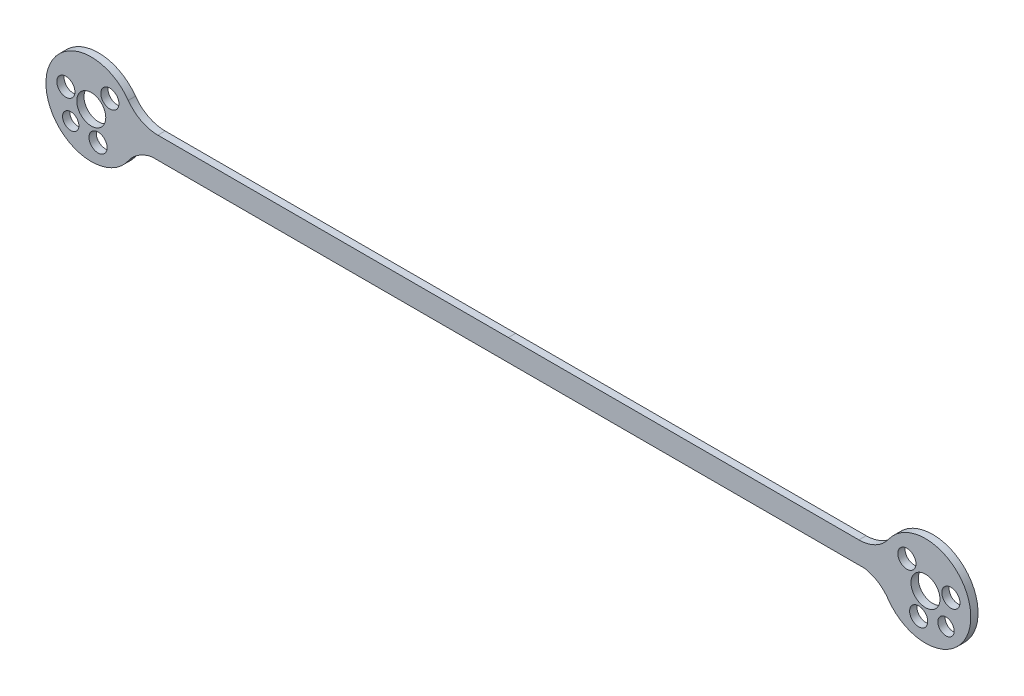
ISO-10303-21;
HEADER;
FILE_DESCRIPTION(('STEP AP214'),'2;1');
FILE_NAME('part.step','',(''),(''),'','','');
FILE_SCHEMA(('AUTOMOTIVE_DESIGN { 1 0 10303 214 1 1 1 1 }'));
ENDSEC;
DATA;
#1=APPLICATION_CONTEXT('core data for automotive mechanical design processes');
#2=APPLICATION_PROTOCOL_DEFINITION('international standard','automotive_design',2000,#1);
#3=PRODUCT_CONTEXT('',#1,'mechanical');
#4=PRODUCT('Part','Part','',(#3));
#5=PRODUCT_RELATED_PRODUCT_CATEGORY('part','',(#4));
#6=PRODUCT_DEFINITION_FORMATION('','',#4);
#7=PRODUCT_DEFINITION_CONTEXT('part definition',#1,'design');
#8=PRODUCT_DEFINITION('design','',#6,#7);
#9=PRODUCT_DEFINITION_SHAPE('','',#8);
#10=(LENGTH_UNIT() NAMED_UNIT(*) SI_UNIT(.MILLI.,.METRE.));
#11=(NAMED_UNIT(*) PLANE_ANGLE_UNIT() SI_UNIT($,.RADIAN.));
#12=(NAMED_UNIT(*) SI_UNIT($,.STERADIAN.) SOLID_ANGLE_UNIT());
#13=UNCERTAINTY_MEASURE_WITH_UNIT(LENGTH_MEASURE(1.E-05),#10,'distance_accuracy_value','');
#14=(GEOMETRIC_REPRESENTATION_CONTEXT(3) GLOBAL_UNCERTAINTY_ASSIGNED_CONTEXT((#13)) GLOBAL_UNIT_ASSIGNED_CONTEXT((#10,
#11,#12)) REPRESENTATION_CONTEXT('',''));
#15=CARTESIAN_POINT('',(0.,0.,0.));
#16=DIRECTION('',(0.,0.,1.));
#17=DIRECTION('',(1.,0.,0.));
#18=AXIS2_PLACEMENT_3D('',#15,#16,#17);
#19=CARTESIAN_POINT('',(-95.6093114809594,-12.4199065155139,2.));
#20=DIRECTION('',(0.,0.,1.));
#21=DIRECTION('',(1.,0.,0.));
#22=AXIS2_PLACEMENT_3D('',#19,#20,#21);
#23=PLANE('',#22);
#24=CARTESIAN_POINT('',(121.578135986042,-5.22643196667232,2.));
#25=DIRECTION('',(0.,0.,1.));
#26=DIRECTION('',(1.,0.,0.));
#27=AXIS2_PLACEMENT_3D('',#24,#25,#26);
#28=CIRCLE('',#27,2.24999999999999);
#29=CARTESIAN_POINT('',(123.828135986042,-5.22643196667232,2.));
#30=VERTEX_POINT('',#29);
#31=EDGE_CURVE('E256',#30,#30,#28,.T.);
#32=ORIENTED_EDGE('',*,*,#31,.F.);
#33=EDGE_LOOP('',(#32));
#34=FACE_BOUND('',#33,.T.);
#35=CARTESIAN_POINT('',(110.794757572947,5.55694644642255,2.));
#36=DIRECTION('',(0.,0.,1.));
#37=DIRECTION('',(1.,0.,0.));
#38=AXIS2_PLACEMENT_3D('',#35,#36,#37);
#39=CIRCLE('',#38,2.49999999999999);
#40=CARTESIAN_POINT('',(113.294757572947,5.55694644642255,2.));
#41=VERTEX_POINT('',#40);
#42=EDGE_CURVE('E244',#41,#41,#39,.T.);
#43=ORIENTED_EDGE('',*,*,#42,.F.);
#44=EDGE_LOOP('',(#43));
#45=FACE_BOUND('',#44,.T.);
#46=CARTESIAN_POINT('',(-114.078604371176,0.430316730024929,2.));
#47=DIRECTION('',(0.,0.,1.));
#48=DIRECTION('',(1.,0.,0.));
#49=AXIS2_PLACEMENT_3D('',#46,#47,#48);
#50=CIRCLE('',#49,4.00000000000003);
#51=CARTESIAN_POINT('',(-110.078604371176,0.430316730024929,2.));
#52=VERTEX_POINT('',#51);
#53=EDGE_CURVE('E232',#52,#52,#50,.T.);
#54=ORIENTED_EDGE('',*,*,#53,.F.);
#55=EDGE_LOOP('',(#54));
#56=FACE_BOUND('',#55,.T.);
#57=CARTESIAN_POINT('',(-108.952194099848,5.55694644642257,2.));
#58=DIRECTION('',(0.,0.,1.));
#59=DIRECTION('',(1.,0.,0.));
#60=AXIS2_PLACEMENT_3D('',#57,#58,#59);
#61=CIRCLE('',#60,2.49999999999999);
#62=CARTESIAN_POINT('',(-106.452194099848,5.55694644642257,2.));
#63=VERTEX_POINT('',#62);
#64=EDGE_CURVE('E220',#63,#63,#61,.T.);
#65=ORIENTED_EDGE('',*,*,#64,.F.);
#66=EDGE_LOOP('',(#65));
#67=FACE_BOUND('',#66,.T.);
#68=CARTESIAN_POINT('',(-119.735572512943,-5.2264319666723,2.));
#69=DIRECTION('',(0.,0.,1.));
#70=DIRECTION('',(1.,0.,0.));
#71=AXIS2_PLACEMENT_3D('',#68,#69,#70);
#72=CIRCLE('',#71,2.25);
#73=CARTESIAN_POINT('',(-117.485572512943,-5.2264319666723,2.));
#74=VERTEX_POINT('',#73);
#75=EDGE_CURVE('E148',#74,#74,#72,.T.);
#76=ORIENTED_EDGE('',*,*,#75,.F.);
#77=EDGE_LOOP('',(#76));
#78=FACE_BOUND('',#77,.T.);
#79=CARTESIAN_POINT('',(-95.6093114809594,-12.4199065155139,2.));
#80=DIRECTION('',(0.,0.,-1.));
#81=DIRECTION('',(1.,0.,0.));
#82=AXIS2_PLACEMENT_3D('',#79,#80,#81);
#83=CIRCLE('',#82,10.);
#84=CARTESIAN_POINT('',(-103.817942709602,-6.70865679656885,2.));
#85=VERTEX_POINT('',#84);
#86=CARTESIAN_POINT('',(-97.3334950671893,-2.56966839854554,2.));
#87=VERTEX_POINT('',#86);
#88=EDGE_CURVE('E163',#85,#87,#83,.T.);
#89=ORIENTED_EDGE('',*,*,#88,.T.);
#90=DIRECTION('',(0.999999999999606,8.88105922566849E-07,0.));
#91=VECTOR('',#90,1.);
#92=CARTESIAN_POINT('',(-97.3334950671893,-2.56966839854554,2.));
#93=LINE('',#92,#91);
#94=CARTESIAN_POINT('',(0.921282847928852,-2.56958113789535,2.));
#95=VERTEX_POINT('',#94);
#96=EDGE_CURVE('E101',#87,#95,#93,.T.);
#97=ORIENTED_EDGE('',*,*,#96,.T.);
#98=DIRECTION('',(0.999999999999337,1.1513676932423E-06,0.));
#99=VECTOR('',#98,1.);
#100=CARTESIAN_POINT('',(0.921282847928852,-2.56958113789535,2.));
#101=LINE('',#100,#99);
#102=CARTESIAN_POINT('',(99.1760607630203,-2.56946801051836,2.));
#103=VERTEX_POINT('',#102);
#104=EDGE_CURVE('E184',#95,#103,#101,.T.);
#105=ORIENTED_EDGE('',*,*,#104,.T.);
#106=CARTESIAN_POINT('',(97.4518972660949,-12.4197096438931,2.));
#107=DIRECTION('',(0.,0.,-1.));
#108=DIRECTION('',(1.,0.,0.));
#109=AXIS2_PLACEMENT_3D('',#106,#107,#108);
#110=CIRCLE('',#109,9.99999999999998);
#111=CARTESIAN_POINT('',(105.660516846778,-6.70844318367315,2.));
#112=VERTEX_POINT('',#111);
#113=EDGE_CURVE('E203',#103,#112,#110,.T.);
#114=ORIENTED_EDGE('',*,*,#113,.T.);
#115=CARTESIAN_POINT('',(115.921163948582,0.430551269254727,2.));
#116=DIRECTION('',(0.,0.,1.));
#117=DIRECTION('',(1.,0.,0.));
#118=AXIS2_PLACEMENT_3D('',#115,#116,#117);
#119=CIRCLE('',#118,12.4998448289046);
#120=CARTESIAN_POINT('',(105.718891057084,7.65272189823466,2.));
#121=VERTEX_POINT('',#120);
#122=EDGE_CURVE('E200',#112,#121,#119,.T.);
#123=ORIENTED_EDGE('',*,*,#122,.T.);
#124=CARTESIAN_POINT('',(97.5569714243648,13.4305301253252,2.));
#125=DIRECTION('',(0.,0.,-1.));
#126=DIRECTION('',(1.,0.,0.));
#127=AXIS2_PLACEMENT_3D('',#124,#125,#126);
#128=CIRCLE('',#127,10.);
#129=CARTESIAN_POINT('',(97.5569829380418,3.43053012533178,2.));
#130=VERTEX_POINT('',#129);
#131=EDGE_CURVE('E202',#121,#130,#128,.T.);
#132=ORIENTED_EDGE('',*,*,#131,.T.);
#133=DIRECTION('',(-0.999999999999337,-1.15136769387057E-06,0.));
#134=VECTOR('',#133,1.);
#135=CARTESIAN_POINT('',(97.5569829380418,3.43053012533178,2.));
#136=LINE('',#135,#134);
#137=CARTESIAN_POINT('',(0.921276729507946,3.43041886210158,2.));
#138=VERTEX_POINT('',#137);
#139=EDGE_CURVE('E126',#130,#138,#136,.T.);
#140=ORIENTED_EDGE('',*,*,#139,.T.);
#141=DIRECTION('',(-0.999999999999606,-8.88105922637127E-07,0.));
#142=VECTOR('',#141,1.);
#143=CARTESIAN_POINT('',(0.921276729507946,3.43041886210158,2.));
#144=LINE('',#143,#142);
#145=CARTESIAN_POINT('',(-95.7144294790519,3.43033303935856,2.));
#146=VERTEX_POINT('',#145);
#147=EDGE_CURVE('E120',#138,#146,#144,.T.);
#148=ORIENTED_EDGE('',*,*,#147,.T.);
#149=CARTESIAN_POINT('',(-95.7144383601111,13.4303330393547,2.));
#150=DIRECTION('',(0.,0.,-1.));
#151=DIRECTION('',(1.,0.,0.));
#152=AXIS2_PLACEMENT_3D('',#149,#150,#151);
#153=CIRCLE('',#152,10.);
#154=CARTESIAN_POINT('',(-103.876346209126,7.65250816625635,2.));
#155=VERTEX_POINT('',#154);
#156=EDGE_CURVE('E124',#146,#155,#153,.T.);
#157=ORIENTED_EDGE('',*,*,#156,.T.);
#158=CARTESIAN_POINT('',(-114.078604371176,0.430316730024929,2.));
#159=DIRECTION('',(0.,0.,1.));
#160=DIRECTION('',(1.,0.,0.));
#161=AXIS2_PLACEMENT_3D('',#158,#159,#160);
#162=CIRCLE('',#161,12.4998448289047);
#163=EDGE_CURVE('E52',#155,#85,#162,.T.);
#164=ORIENTED_EDGE('',*,*,#163,.T.);
#165=EDGE_LOOP('',(#89,#97,#105,#114,#123,#132,#140,#148,#157,#164));
#166=FACE_BOUND('',#165,.T.);
#167=CARTESIAN_POINT('',(-121.081680504046,2.30686035981335,2.));
#168=DIRECTION('',(0.,0.,1.));
#169=DIRECTION('',(1.,0.,0.));
#170=AXIS2_PLACEMENT_3D('',#167,#168,#169);
#171=CIRCLE('',#170,2.50000000000002);
#172=CARTESIAN_POINT('',(-118.581680504046,2.30686035981335,2.));
#173=VERTEX_POINT('',#172);
#174=EDGE_CURVE('E214',#173,#173,#171,.T.);
#175=ORIENTED_EDGE('',*,*,#174,.F.);
#176=EDGE_LOOP('',(#175));
#177=FACE_BOUND('',#176,.T.);
#178=CARTESIAN_POINT('',(-112.202280186457,-6.57253995777565,2.));
#179=DIRECTION('',(0.,0.,1.));
#180=DIRECTION('',(1.,0.,0.));
#181=AXIS2_PLACEMENT_3D('',#178,#179,#180);
#182=CIRCLE('',#181,2.49999999999999);
#183=CARTESIAN_POINT('',(-109.702280186457,-6.57253995777565,2.));
#184=VERTEX_POINT('',#183);
#185=EDGE_CURVE('E226',#184,#184,#182,.T.);
#186=ORIENTED_EDGE('',*,*,#185,.F.);
#187=EDGE_LOOP('',(#186));
#188=FACE_BOUND('',#187,.T.);
#189=CARTESIAN_POINT('',(115.921163948582,0.430551269254727,2.));
#190=DIRECTION('',(0.,0.,1.));
#191=DIRECTION('',(1.,0.,0.));
#192=AXIS2_PLACEMENT_3D('',#189,#190,#191);
#193=CIRCLE('',#192,4.0000000000002);
#194=CARTESIAN_POINT('',(119.921163948582,0.430551269254727,2.));
#195=VERTEX_POINT('',#194);
#196=EDGE_CURVE('E238',#195,#195,#193,.T.);
#197=ORIENTED_EDGE('',*,*,#196,.F.);
#198=EDGE_LOOP('',(#197));
#199=FACE_BOUND('',#198,.T.);
#200=CARTESIAN_POINT('',(122.924243977146,2.30686035981333,2.));
#201=DIRECTION('',(0.,0.,1.));
#202=DIRECTION('',(1.,0.,0.));
#203=AXIS2_PLACEMENT_3D('',#200,#201,#202);
#204=CIRCLE('',#203,2.5);
#205=CARTESIAN_POINT('',(125.424243977146,2.30686035981333,2.));
#206=VERTEX_POINT('',#205);
#207=EDGE_CURVE('E250',#206,#206,#204,.T.);
#208=ORIENTED_EDGE('',*,*,#207,.F.);
#209=EDGE_LOOP('',(#208));
#210=FACE_BOUND('',#209,.T.);
#211=CARTESIAN_POINT('',(114.044843659557,-6.57253995777567,2.));
#212=DIRECTION('',(0.,0.,1.));
#213=DIRECTION('',(1.,0.,0.));
#214=AXIS2_PLACEMENT_3D('',#211,#212,#213);
#215=CIRCLE('',#214,2.5);
#216=CARTESIAN_POINT('',(116.544843659557,-6.57253995777567,2.));
#217=VERTEX_POINT('',#216);
#218=EDGE_CURVE('E262',#217,#217,#215,.T.);
#219=ORIENTED_EDGE('',*,*,#218,.F.);
#220=EDGE_LOOP('',(#219));
#221=FACE_BOUND('',#220,.T.);
#222=ADVANCED_FACE('F35',(#34,#45,#56,#67,#78,#166,#177,#188,#199,#210,#221),#23,.T.);
#223=CARTESIAN_POINT('',(-95.6093114809594,-12.4199065155139,0.));
#224=DIRECTION('',(0.,0.,1.));
#225=DIRECTION('',(1.,0.,0.));
#226=AXIS2_PLACEMENT_3D('',#223,#224,#225);
#227=PLANE('',#226);
#228=CARTESIAN_POINT('',(-95.6093114809594,-12.4199065155139,0.));
#229=DIRECTION('',(0.,0.,-1.));
#230=DIRECTION('',(1.,0.,0.));
#231=AXIS2_PLACEMENT_3D('',#228,#229,#230);
#232=CIRCLE('',#231,10.);
#233=CARTESIAN_POINT('',(-103.817942709602,-6.70865679656885,0.));
#234=VERTEX_POINT('',#233);
#235=CARTESIAN_POINT('',(-97.3334950671893,-2.56966839854554,0.));
#236=VERTEX_POINT('',#235);
#237=EDGE_CURVE('E144',#234,#236,#232,.T.);
#238=ORIENTED_EDGE('',*,*,#237,.F.);
#239=CARTESIAN_POINT('',(-114.078604371176,0.430316730024929,0.));
#240=DIRECTION('',(0.,0.,1.));
#241=DIRECTION('',(1.,0.,0.));
#242=AXIS2_PLACEMENT_3D('',#239,#240,#241);
#243=CIRCLE('',#242,12.4998448289047);
#244=CARTESIAN_POINT('',(-103.876346209126,7.65250816625635,0.));
#245=VERTEX_POINT('',#244);
#246=EDGE_CURVE('E93',#245,#234,#243,.T.);
#247=ORIENTED_EDGE('',*,*,#246,.F.);
#248=CARTESIAN_POINT('',(-95.7144383601111,13.4303330393547,0.));
#249=DIRECTION('',(0.,0.,-1.));
#250=DIRECTION('',(1.,0.,0.));
#251=AXIS2_PLACEMENT_3D('',#248,#249,#250);
#252=CIRCLE('',#251,10.);
#253=CARTESIAN_POINT('',(-95.7144294790519,3.43033303935856,0.));
#254=VERTEX_POINT('',#253);
#255=EDGE_CURVE('E87',#254,#245,#252,.T.);
#256=ORIENTED_EDGE('',*,*,#255,.F.);
#257=DIRECTION('',(-0.999999999999606,-8.88105922637127E-07,0.));
#258=VECTOR('',#257,1.);
#259=CARTESIAN_POINT('',(0.921276729507946,3.43041886210158,0.));
#260=LINE('',#259,#258);
#261=CARTESIAN_POINT('',(0.921276729507946,3.43041886210158,0.));
#262=VERTEX_POINT('',#261);
#263=EDGE_CURVE('E134',#262,#254,#260,.T.);
#264=ORIENTED_EDGE('',*,*,#263,.F.);
#265=DIRECTION('',(-0.999999999999337,-1.15136769387057E-06,0.));
#266=VECTOR('',#265,1.);
#267=CARTESIAN_POINT('',(97.5569829380418,3.43053012533178,0.));
#268=LINE('',#267,#266);
#269=CARTESIAN_POINT('',(97.5569829380418,3.43053012533178,0.));
#270=VERTEX_POINT('',#269);
#271=EDGE_CURVE('E158',#270,#262,#268,.T.);
#272=ORIENTED_EDGE('',*,*,#271,.F.);
#273=CARTESIAN_POINT('',(97.5569714243648,13.4305301253252,0.));
#274=DIRECTION('',(0.,0.,-1.));
#275=DIRECTION('',(1.,0.,0.));
#276=AXIS2_PLACEMENT_3D('',#273,#274,#275);
#277=CIRCLE('',#276,10.);
#278=CARTESIAN_POINT('',(105.718891057084,7.65272189823466,0.));
#279=VERTEX_POINT('',#278);
#280=EDGE_CURVE('E156',#279,#270,#277,.T.);
#281=ORIENTED_EDGE('',*,*,#280,.F.);
#282=CARTESIAN_POINT('',(115.921163948582,0.430551269254727,0.));
#283=DIRECTION('',(0.,0.,1.));
#284=DIRECTION('',(1.,0.,0.));
#285=AXIS2_PLACEMENT_3D('',#282,#283,#284);
#286=CIRCLE('',#285,12.4998448289046);
#287=CARTESIAN_POINT('',(105.660516846778,-6.70844318367315,0.));
#288=VERTEX_POINT('',#287);
#289=EDGE_CURVE('E154',#288,#279,#286,.T.);
#290=ORIENTED_EDGE('',*,*,#289,.F.);
#291=CARTESIAN_POINT('',(97.4518972660949,-12.4197096438931,0.));
#292=DIRECTION('',(0.,0.,-1.));
#293=DIRECTION('',(1.,0.,0.));
#294=AXIS2_PLACEMENT_3D('',#291,#292,#293);
#295=CIRCLE('',#294,9.99999999999998);
#296=CARTESIAN_POINT('',(99.1760607630203,-2.56946801051836,0.));
#297=VERTEX_POINT('',#296);
#298=EDGE_CURVE('E152',#297,#288,#295,.T.);
#299=ORIENTED_EDGE('',*,*,#298,.F.);
#300=DIRECTION('',(0.999999999999337,1.1513676932423E-06,0.));
#301=VECTOR('',#300,1.);
#302=CARTESIAN_POINT('',(0.921282847928852,-2.56958113789535,0.));
#303=LINE('',#302,#301);
#304=CARTESIAN_POINT('',(0.921282847928852,-2.56958113789535,0.));
#305=VERTEX_POINT('',#304);
#306=EDGE_CURVE('E150',#305,#297,#303,.T.);
#307=ORIENTED_EDGE('',*,*,#306,.F.);
#308=DIRECTION('',(0.999999999999606,8.88105922566849E-07,0.));
#309=VECTOR('',#308,1.);
#310=CARTESIAN_POINT('',(-97.3334950671893,-2.56966839854554,0.));
#311=LINE('',#310,#309);
#312=EDGE_CURVE('E147',#236,#305,#311,.T.);
#313=ORIENTED_EDGE('',*,*,#312,.F.);
#314=EDGE_LOOP('',(#238,#247,#256,#264,#272,#281,#290,#299,#307,#313));
#315=FACE_BOUND('',#314,.T.);
#316=CARTESIAN_POINT('',(-119.735572512943,-5.2264319666723,0.));
#317=DIRECTION('',(0.,0.,1.));
#318=DIRECTION('',(1.,0.,0.));
#319=AXIS2_PLACEMENT_3D('',#316,#317,#318);
#320=CIRCLE('',#319,2.25);
#321=CARTESIAN_POINT('',(-117.485572512943,-5.2264319666723,0.));
#322=VERTEX_POINT('',#321);
#323=EDGE_CURVE('E211',#322,#322,#320,.T.);
#324=ORIENTED_EDGE('',*,*,#323,.T.);
#325=EDGE_LOOP('',(#324));
#326=FACE_BOUND('',#325,.T.);
#327=CARTESIAN_POINT('',(-121.081680504046,2.30686035981335,0.));
#328=DIRECTION('',(0.,0.,1.));
#329=DIRECTION('',(1.,0.,0.));
#330=AXIS2_PLACEMENT_3D('',#327,#328,#329);
#331=CIRCLE('',#330,2.50000000000002);
#332=CARTESIAN_POINT('',(-118.581680504046,2.30686035981335,0.));
#333=VERTEX_POINT('',#332);
#334=EDGE_CURVE('E217',#333,#333,#331,.T.);
#335=ORIENTED_EDGE('',*,*,#334,.T.);
#336=EDGE_LOOP('',(#335));
#337=FACE_BOUND('',#336,.T.);
#338=CARTESIAN_POINT('',(-108.952194099848,5.55694644642257,0.));
#339=DIRECTION('',(0.,0.,1.));
#340=DIRECTION('',(1.,0.,0.));
#341=AXIS2_PLACEMENT_3D('',#338,#339,#340);
#342=CIRCLE('',#341,2.49999999999999);
#343=CARTESIAN_POINT('',(-106.452194099848,5.55694644642257,0.));
#344=VERTEX_POINT('',#343);
#345=EDGE_CURVE('E223',#344,#344,#342,.T.);
#346=ORIENTED_EDGE('',*,*,#345,.T.);
#347=EDGE_LOOP('',(#346));
#348=FACE_BOUND('',#347,.T.);
#349=CARTESIAN_POINT('',(-112.202280186457,-6.57253995777565,0.));
#350=DIRECTION('',(0.,0.,1.));
#351=DIRECTION('',(1.,0.,0.));
#352=AXIS2_PLACEMENT_3D('',#349,#350,#351);
#353=CIRCLE('',#352,2.49999999999999);
#354=CARTESIAN_POINT('',(-109.702280186457,-6.57253995777565,0.));
#355=VERTEX_POINT('',#354);
#356=EDGE_CURVE('E229',#355,#355,#353,.T.);
#357=ORIENTED_EDGE('',*,*,#356,.T.);
#358=EDGE_LOOP('',(#357));
#359=FACE_BOUND('',#358,.T.);
#360=CARTESIAN_POINT('',(-114.078604371176,0.430316730024929,0.));
#361=DIRECTION('',(0.,0.,1.));
#362=DIRECTION('',(1.,0.,0.));
#363=AXIS2_PLACEMENT_3D('',#360,#361,#362);
#364=CIRCLE('',#363,4.00000000000003);
#365=CARTESIAN_POINT('',(-110.078604371176,0.430316730024929,0.));
#366=VERTEX_POINT('',#365);
#367=EDGE_CURVE('E235',#366,#366,#364,.T.);
#368=ORIENTED_EDGE('',*,*,#367,.T.);
#369=EDGE_LOOP('',(#368));
#370=FACE_BOUND('',#369,.T.);
#371=CARTESIAN_POINT('',(115.921163948582,0.430551269254727,0.));
#372=DIRECTION('',(0.,0.,1.));
#373=DIRECTION('',(1.,0.,0.));
#374=AXIS2_PLACEMENT_3D('',#371,#372,#373);
#375=CIRCLE('',#374,4.0000000000002);
#376=CARTESIAN_POINT('',(119.921163948582,0.430551269254727,0.));
#377=VERTEX_POINT('',#376);
#378=EDGE_CURVE('E241',#377,#377,#375,.T.);
#379=ORIENTED_EDGE('',*,*,#378,.T.);
#380=EDGE_LOOP('',(#379));
#381=FACE_BOUND('',#380,.T.);
#382=CARTESIAN_POINT('',(110.794757572947,5.55694644642255,0.));
#383=DIRECTION('',(0.,0.,1.));
#384=DIRECTION('',(1.,0.,0.));
#385=AXIS2_PLACEMENT_3D('',#382,#383,#384);
#386=CIRCLE('',#385,2.49999999999999);
#387=CARTESIAN_POINT('',(113.294757572947,5.55694644642255,0.));
#388=VERTEX_POINT('',#387);
#389=EDGE_CURVE('E247',#388,#388,#386,.T.);
#390=ORIENTED_EDGE('',*,*,#389,.T.);
#391=EDGE_LOOP('',(#390));
#392=FACE_BOUND('',#391,.T.);
#393=CARTESIAN_POINT('',(122.924243977146,2.30686035981333,0.));
#394=DIRECTION('',(0.,0.,1.));
#395=DIRECTION('',(1.,0.,0.));
#396=AXIS2_PLACEMENT_3D('',#393,#394,#395);
#397=CIRCLE('',#396,2.5);
#398=CARTESIAN_POINT('',(125.424243977146,2.30686035981333,0.));
#399=VERTEX_POINT('',#398);
#400=EDGE_CURVE('E253',#399,#399,#397,.T.);
#401=ORIENTED_EDGE('',*,*,#400,.T.);
#402=EDGE_LOOP('',(#401));
#403=FACE_BOUND('',#402,.T.);
#404=CARTESIAN_POINT('',(121.578135986042,-5.22643196667232,0.));
#405=DIRECTION('',(0.,0.,1.));
#406=DIRECTION('',(1.,0.,0.));
#407=AXIS2_PLACEMENT_3D('',#404,#405,#406);
#408=CIRCLE('',#407,2.24999999999999);
#409=CARTESIAN_POINT('',(123.828135986042,-5.22643196667232,0.));
#410=VERTEX_POINT('',#409);
#411=EDGE_CURVE('E259',#410,#410,#408,.T.);
#412=ORIENTED_EDGE('',*,*,#411,.T.);
#413=EDGE_LOOP('',(#412));
#414=FACE_BOUND('',#413,.T.);
#415=CARTESIAN_POINT('',(114.044843659557,-6.57253995777567,0.));
#416=DIRECTION('',(0.,0.,1.));
#417=DIRECTION('',(1.,0.,0.));
#418=AXIS2_PLACEMENT_3D('',#415,#416,#417);
#419=CIRCLE('',#418,2.5);
#420=CARTESIAN_POINT('',(116.544843659557,-6.57253995777567,0.));
#421=VERTEX_POINT('',#420);
#422=EDGE_CURVE('E265',#421,#421,#419,.T.);
#423=ORIENTED_EDGE('',*,*,#422,.T.);
#424=EDGE_LOOP('',(#423));
#425=FACE_BOUND('',#424,.T.);
#426=ADVANCED_FACE('F188',(#315,#326,#337,#348,#359,#370,#381,#392,#403,#414,#425),#227,.F.);
#427=CARTESIAN_POINT('',(-95.6093114809594,-12.4199065155139,2.));
#428=DIRECTION('',(0.,0.,-1.));
#429=DIRECTION('',(-1.,0.,0.));
#430=AXIS2_PLACEMENT_3D('',#427,#428,#429);
#431=CYLINDRICAL_SURFACE('',#430,10.);
#432=ORIENTED_EDGE('',*,*,#237,.T.);
#433=DIRECTION('',(0.,0.,-1.));
#434=VECTOR('',#433,1.);
#435=CARTESIAN_POINT('',(-97.3334950671893,-2.56966839854554,2.));
#436=LINE('',#435,#434);
#437=EDGE_CURVE('E11',#87,#236,#436,.T.);
#438=ORIENTED_EDGE('',*,*,#437,.F.);
#439=ORIENTED_EDGE('',*,*,#88,.F.);
#440=DIRECTION('',(0.,0.,-1.));
#441=VECTOR('',#440,1.);
#442=CARTESIAN_POINT('',(-103.817942709602,-6.70865679656885,2.));
#443=LINE('',#442,#441);
#444=EDGE_CURVE('E140',#85,#234,#443,.T.);
#445=ORIENTED_EDGE('',*,*,#444,.T.);
#446=EDGE_LOOP('',(#432,#438,#439,#445));
#447=FACE_BOUND('',#446,.T.);
#448=ADVANCED_FACE('F37',(#447),#431,.F.);
#449=CARTESIAN_POINT('',(-97.3334950671893,-2.56966839854554,2.));
#450=DIRECTION('',(-8.88105922566849E-07,0.999999999999606,0.));
#451=DIRECTION('',(-0.999999999999606,-8.88105922566849E-07,0.));
#452=AXIS2_PLACEMENT_3D('',#449,#450,#451);
#453=PLANE('',#452);
#454=ORIENTED_EDGE('',*,*,#312,.T.);
#455=DIRECTION('',(0.,0.,-1.));
#456=VECTOR('',#455,1.);
#457=CARTESIAN_POINT('',(0.921282847928852,-2.56958113789535,2.));
#458=LINE('',#457,#456);
#459=EDGE_CURVE('E44',#95,#305,#458,.T.);
#460=ORIENTED_EDGE('',*,*,#459,.F.);
#461=ORIENTED_EDGE('',*,*,#96,.F.);
#462=ORIENTED_EDGE('',*,*,#437,.T.);
#463=EDGE_LOOP('',(#454,#460,#461,#462));
#464=FACE_BOUND('',#463,.T.);
#465=ADVANCED_FACE('F307',(#464),#453,.F.);
#466=CARTESIAN_POINT('',(0.921282847928852,-2.56958113789535,2.));
#467=DIRECTION('',(-1.1513676932423E-06,0.999999999999337,0.));
#468=DIRECTION('',(-0.999999999999337,-1.1513676932423E-06,0.));
#469=AXIS2_PLACEMENT_3D('',#466,#467,#468);
#470=PLANE('',#469);
#471=ORIENTED_EDGE('',*,*,#306,.T.);
#472=DIRECTION('',(0.,0.,-1.));
#473=VECTOR('',#472,1.);
#474=CARTESIAN_POINT('',(99.1760607630203,-2.56946801051836,2.));
#475=LINE('',#474,#473);
#476=EDGE_CURVE('E176',#103,#297,#475,.T.);
#477=ORIENTED_EDGE('',*,*,#476,.F.);
#478=ORIENTED_EDGE('',*,*,#104,.F.);
#479=ORIENTED_EDGE('',*,*,#459,.T.);
#480=EDGE_LOOP('',(#471,#477,#478,#479));
#481=FACE_BOUND('',#480,.T.);
#482=ADVANCED_FACE('F182',(#481),#470,.F.);
#483=CARTESIAN_POINT('',(97.4518972660949,-12.4197096438931,2.));
#484=DIRECTION('',(0.,0.,-1.));
#485=DIRECTION('',(-1.,0.,0.));
#486=AXIS2_PLACEMENT_3D('',#483,#484,#485);
#487=CYLINDRICAL_SURFACE('',#486,9.99999999999998);
#488=ORIENTED_EDGE('',*,*,#298,.T.);
#489=DIRECTION('',(0.,0.,-1.));
#490=VECTOR('',#489,1.);
#491=CARTESIAN_POINT('',(105.660516846778,-6.70844318367315,2.));
#492=LINE('',#491,#490);
#493=EDGE_CURVE('E173',#112,#288,#492,.T.);
#494=ORIENTED_EDGE('',*,*,#493,.F.);
#495=ORIENTED_EDGE('',*,*,#113,.F.);
#496=ORIENTED_EDGE('',*,*,#476,.T.);
#497=EDGE_LOOP('',(#488,#494,#495,#496));
#498=FACE_BOUND('',#497,.T.);
#499=ADVANCED_FACE('F194',(#498),#487,.F.);
#500=CARTESIAN_POINT('',(115.921163948582,0.430551269254727,2.));
#501=DIRECTION('',(0.,0.,-1.));
#502=DIRECTION('',(-1.,0.,0.));
#503=AXIS2_PLACEMENT_3D('',#500,#501,#502);
#504=CYLINDRICAL_SURFACE('',#503,12.4998448289046);
#505=ORIENTED_EDGE('',*,*,#289,.T.);
#506=DIRECTION('',(0.,0.,-1.));
#507=VECTOR('',#506,1.);
#508=CARTESIAN_POINT('',(105.718891057084,7.65272189823466,2.));
#509=LINE('',#508,#507);
#510=EDGE_CURVE('E170',#121,#279,#509,.T.);
#511=ORIENTED_EDGE('',*,*,#510,.F.);
#512=ORIENTED_EDGE('',*,*,#122,.F.);
#513=ORIENTED_EDGE('',*,*,#493,.T.);
#514=EDGE_LOOP('',(#505,#511,#512,#513));
#515=FACE_BOUND('',#514,.T.);
#516=ADVANCED_FACE('F198',(#515),#504,.T.);
#517=CARTESIAN_POINT('',(97.5569714243648,13.4305301253252,2.));
#518=DIRECTION('',(0.,0.,-1.));
#519=DIRECTION('',(-1.,0.,0.));
#520=AXIS2_PLACEMENT_3D('',#517,#518,#519);
#521=CYLINDRICAL_SURFACE('',#520,10.);
#522=ORIENTED_EDGE('',*,*,#280,.T.);
#523=DIRECTION('',(0.,0.,-1.));
#524=VECTOR('',#523,1.);
#525=CARTESIAN_POINT('',(97.5569829380418,3.43053012533178,2.));
#526=LINE('',#525,#524);
#527=EDGE_CURVE('E167',#130,#270,#526,.T.);
#528=ORIENTED_EDGE('',*,*,#527,.F.);
#529=ORIENTED_EDGE('',*,*,#131,.F.);
#530=ORIENTED_EDGE('',*,*,#510,.T.);
#531=EDGE_LOOP('',(#522,#528,#529,#530));
#532=FACE_BOUND('',#531,.T.);
#533=ADVANCED_FACE('F297',(#532),#521,.F.);
#534=CARTESIAN_POINT('',(97.5569829380418,3.43053012533178,2.));
#535=DIRECTION('',(1.15136769387057E-06,-0.999999999999337,0.));
#536=DIRECTION('',(0.999999999999337,1.15136769387057E-06,0.));
#537=AXIS2_PLACEMENT_3D('',#534,#535,#536);
#538=PLANE('',#537);
#539=ORIENTED_EDGE('',*,*,#271,.T.);
#540=DIRECTION('',(0.,0.,-1.));
#541=VECTOR('',#540,1.);
#542=CARTESIAN_POINT('',(0.921276729507946,3.43041886210158,2.));
#543=LINE('',#542,#541);
#544=EDGE_CURVE('E135',#138,#262,#543,.T.);
#545=ORIENTED_EDGE('',*,*,#544,.F.);
#546=ORIENTED_EDGE('',*,*,#139,.F.);
#547=ORIENTED_EDGE('',*,*,#527,.T.);
#548=EDGE_LOOP('',(#539,#545,#546,#547));
#549=FACE_BOUND('',#548,.T.);
#550=ADVANCED_FACE('F294',(#549),#538,.F.);
#551=CARTESIAN_POINT('',(0.921276729507946,3.43041886210158,2.));
#552=DIRECTION('',(8.88105922637127E-07,-0.999999999999606,0.));
#553=DIRECTION('',(0.999999999999606,8.88105922637127E-07,0.));
#554=AXIS2_PLACEMENT_3D('',#551,#552,#553);
#555=PLANE('',#554);
#556=ORIENTED_EDGE('',*,*,#263,.T.);
#557=DIRECTION('',(0.,0.,-1.));
#558=VECTOR('',#557,1.);
#559=CARTESIAN_POINT('',(-95.7144294790519,3.43033303935856,2.));
#560=LINE('',#559,#558);
#561=EDGE_CURVE('E131',#146,#254,#560,.T.);
#562=ORIENTED_EDGE('',*,*,#561,.F.);
#563=ORIENTED_EDGE('',*,*,#147,.F.);
#564=ORIENTED_EDGE('',*,*,#544,.T.);
#565=EDGE_LOOP('',(#556,#562,#563,#564));
#566=FACE_BOUND('',#565,.T.);
#567=ADVANCED_FACE('F132',(#566),#555,.F.);
#568=CARTESIAN_POINT('',(-95.7144383601111,13.4303330393547,2.));
#569=DIRECTION('',(0.,0.,-1.));
#570=DIRECTION('',(-1.,0.,0.));
#571=AXIS2_PLACEMENT_3D('',#568,#569,#570);
#572=CYLINDRICAL_SURFACE('',#571,10.);
#573=ORIENTED_EDGE('',*,*,#255,.T.);
#574=DIRECTION('',(0.,0.,-1.));
#575=VECTOR('',#574,1.);
#576=CARTESIAN_POINT('',(-103.876346209126,7.65250816625635,2.));
#577=LINE('',#576,#575);
#578=EDGE_CURVE('E136',#155,#245,#577,.T.);
#579=ORIENTED_EDGE('',*,*,#578,.F.);
#580=ORIENTED_EDGE('',*,*,#156,.F.);
#581=ORIENTED_EDGE('',*,*,#561,.T.);
#582=EDGE_LOOP('',(#573,#579,#580,#581));
#583=FACE_BOUND('',#582,.T.);
#584=ADVANCED_FACE('F138',(#583),#572,.F.);
#585=CARTESIAN_POINT('',(-114.078604371176,0.430316730024929,2.));
#586=DIRECTION('',(0.,0.,-1.));
#587=DIRECTION('',(-1.,0.,0.));
#588=AXIS2_PLACEMENT_3D('',#585,#586,#587);
#589=CYLINDRICAL_SURFACE('',#588,12.4998448289047);
#590=ORIENTED_EDGE('',*,*,#246,.T.);
#591=ORIENTED_EDGE('',*,*,#444,.F.);
#592=ORIENTED_EDGE('',*,*,#163,.F.);
#593=ORIENTED_EDGE('',*,*,#578,.T.);
#594=EDGE_LOOP('',(#590,#591,#592,#593));
#595=FACE_BOUND('',#594,.T.);
#596=ADVANCED_FACE('F287',(#595),#589,.T.);
#597=CARTESIAN_POINT('',(-119.735572512943,-5.2264319666723,2.));
#598=DIRECTION('',(0.,0.,-1.));
#599=DIRECTION('',(-1.,0.,0.));
#600=AXIS2_PLACEMENT_3D('',#597,#598,#599);
#601=CYLINDRICAL_SURFACE('',#600,2.25);
#602=ORIENTED_EDGE('',*,*,#75,.T.);
#603=EDGE_LOOP('',(#602));
#604=FACE_BOUND('',#603,.T.);
#605=ORIENTED_EDGE('',*,*,#323,.F.);
#606=EDGE_LOOP('',(#605));
#607=FACE_BOUND('',#606,.T.);
#608=ADVANCED_FACE('F284',(#604,#607),#601,.F.);
#609=CARTESIAN_POINT('',(-121.081680504046,2.30686035981335,2.));
#610=DIRECTION('',(0.,0.,-1.));
#611=DIRECTION('',(-1.,0.,0.));
#612=AXIS2_PLACEMENT_3D('',#609,#610,#611);
#613=CYLINDRICAL_SURFACE('',#612,2.50000000000002);
#614=ORIENTED_EDGE('',*,*,#174,.T.);
#615=EDGE_LOOP('',(#614));
#616=FACE_BOUND('',#615,.T.);
#617=ORIENTED_EDGE('',*,*,#334,.F.);
#618=EDGE_LOOP('',(#617));
#619=FACE_BOUND('',#618,.T.);
#620=ADVANCED_FACE('F383',(#616,#619),#613,.F.);
#621=CARTESIAN_POINT('',(-108.952194099848,5.55694644642257,2.));
#622=DIRECTION('',(0.,0.,-1.));
#623=DIRECTION('',(-1.,0.,0.));
#624=AXIS2_PLACEMENT_3D('',#621,#622,#623);
#625=CYLINDRICAL_SURFACE('',#624,2.49999999999999);
#626=ORIENTED_EDGE('',*,*,#64,.T.);
#627=EDGE_LOOP('',(#626));
#628=FACE_BOUND('',#627,.T.);
#629=ORIENTED_EDGE('',*,*,#345,.F.);
#630=EDGE_LOOP('',(#629));
#631=FACE_BOUND('',#630,.T.);
#632=ADVANCED_FACE('F391',(#628,#631),#625,.F.);
#633=CARTESIAN_POINT('',(-112.202280186457,-6.57253995777565,2.));
#634=DIRECTION('',(0.,0.,-1.));
#635=DIRECTION('',(-1.,0.,0.));
#636=AXIS2_PLACEMENT_3D('',#633,#634,#635);
#637=CYLINDRICAL_SURFACE('',#636,2.49999999999999);
#638=ORIENTED_EDGE('',*,*,#185,.T.);
#639=EDGE_LOOP('',(#638));
#640=FACE_BOUND('',#639,.T.);
#641=ORIENTED_EDGE('',*,*,#356,.F.);
#642=EDGE_LOOP('',(#641));
#643=FACE_BOUND('',#642,.T.);
#644=ADVANCED_FACE('F399',(#640,#643),#637,.F.);
#645=CARTESIAN_POINT('',(-114.078604371176,0.430316730024929,2.));
#646=DIRECTION('',(0.,0.,-1.));
#647=DIRECTION('',(-1.,0.,0.));
#648=AXIS2_PLACEMENT_3D('',#645,#646,#647);
#649=CYLINDRICAL_SURFACE('',#648,4.00000000000003);
#650=ORIENTED_EDGE('',*,*,#53,.T.);
#651=EDGE_LOOP('',(#650));
#652=FACE_BOUND('',#651,.T.);
#653=ORIENTED_EDGE('',*,*,#367,.F.);
#654=EDGE_LOOP('',(#653));
#655=FACE_BOUND('',#654,.T.);
#656=ADVANCED_FACE('F408',(#652,#655),#649,.F.);
#657=CARTESIAN_POINT('',(115.921163948582,0.430551269254727,2.));
#658=DIRECTION('',(0.,0.,-1.));
#659=DIRECTION('',(-1.,0.,0.));
#660=AXIS2_PLACEMENT_3D('',#657,#658,#659);
#661=CYLINDRICAL_SURFACE('',#660,4.0000000000002);
#662=ORIENTED_EDGE('',*,*,#196,.T.);
#663=EDGE_LOOP('',(#662));
#664=FACE_BOUND('',#663,.T.);
#665=ORIENTED_EDGE('',*,*,#378,.F.);
#666=EDGE_LOOP('',(#665));
#667=FACE_BOUND('',#666,.T.);
#668=ADVANCED_FACE('F417',(#664,#667),#661,.F.);
#669=CARTESIAN_POINT('',(110.794757572947,5.55694644642255,2.));
#670=DIRECTION('',(0.,0.,-1.));
#671=DIRECTION('',(-1.,0.,0.));
#672=AXIS2_PLACEMENT_3D('',#669,#670,#671);
#673=CYLINDRICAL_SURFACE('',#672,2.49999999999999);
#674=ORIENTED_EDGE('',*,*,#42,.T.);
#675=EDGE_LOOP('',(#674));
#676=FACE_BOUND('',#675,.T.);
#677=ORIENTED_EDGE('',*,*,#389,.F.);
#678=EDGE_LOOP('',(#677));
#679=FACE_BOUND('',#678,.T.);
#680=ADVANCED_FACE('F426',(#676,#679),#673,.F.);
#681=CARTESIAN_POINT('',(122.924243977146,2.30686035981333,2.));
#682=DIRECTION('',(0.,0.,-1.));
#683=DIRECTION('',(-1.,0.,0.));
#684=AXIS2_PLACEMENT_3D('',#681,#682,#683);
#685=CYLINDRICAL_SURFACE('',#684,2.5);
#686=ORIENTED_EDGE('',*,*,#207,.T.);
#687=EDGE_LOOP('',(#686));
#688=FACE_BOUND('',#687,.T.);
#689=ORIENTED_EDGE('',*,*,#400,.F.);
#690=EDGE_LOOP('',(#689));
#691=FACE_BOUND('',#690,.T.);
#692=ADVANCED_FACE('F435',(#688,#691),#685,.F.);
#693=CARTESIAN_POINT('',(121.578135986042,-5.22643196667232,2.));
#694=DIRECTION('',(0.,0.,-1.));
#695=DIRECTION('',(-1.,0.,0.));
#696=AXIS2_PLACEMENT_3D('',#693,#694,#695);
#697=CYLINDRICAL_SURFACE('',#696,2.24999999999999);
#698=ORIENTED_EDGE('',*,*,#31,.T.);
#699=EDGE_LOOP('',(#698));
#700=FACE_BOUND('',#699,.T.);
#701=ORIENTED_EDGE('',*,*,#411,.F.);
#702=EDGE_LOOP('',(#701));
#703=FACE_BOUND('',#702,.T.);
#704=ADVANCED_FACE('F444',(#700,#703),#697,.F.);
#705=CARTESIAN_POINT('',(114.044843659557,-6.57253995777567,2.));
#706=DIRECTION('',(0.,0.,-1.));
#707=DIRECTION('',(-1.,0.,0.));
#708=AXIS2_PLACEMENT_3D('',#705,#706,#707);
#709=CYLINDRICAL_SURFACE('',#708,2.5);
#710=ORIENTED_EDGE('',*,*,#218,.T.);
#711=EDGE_LOOP('',(#710));
#712=FACE_BOUND('',#711,.T.);
#713=ORIENTED_EDGE('',*,*,#422,.F.);
#714=EDGE_LOOP('',(#713));
#715=FACE_BOUND('',#714,.T.);
#716=ADVANCED_FACE('F271',(#712,#715),#709,.F.);
#717=CLOSED_SHELL('',(#222,#426,#448,#465,#482,#499,#516,#533,#550,#567,#584,#596,#608,#620,
#632,#644,#656,#668,#680,#692,#704,#716));
#718=MANIFOLD_SOLID_BREP('B2',#717);
#719=ADVANCED_BREP_SHAPE_REPRESENTATION('',(#18,#718),#14);
#720=SHAPE_DEFINITION_REPRESENTATION(#9,#719);
ENDSEC;
END-ISO-10303-21;
